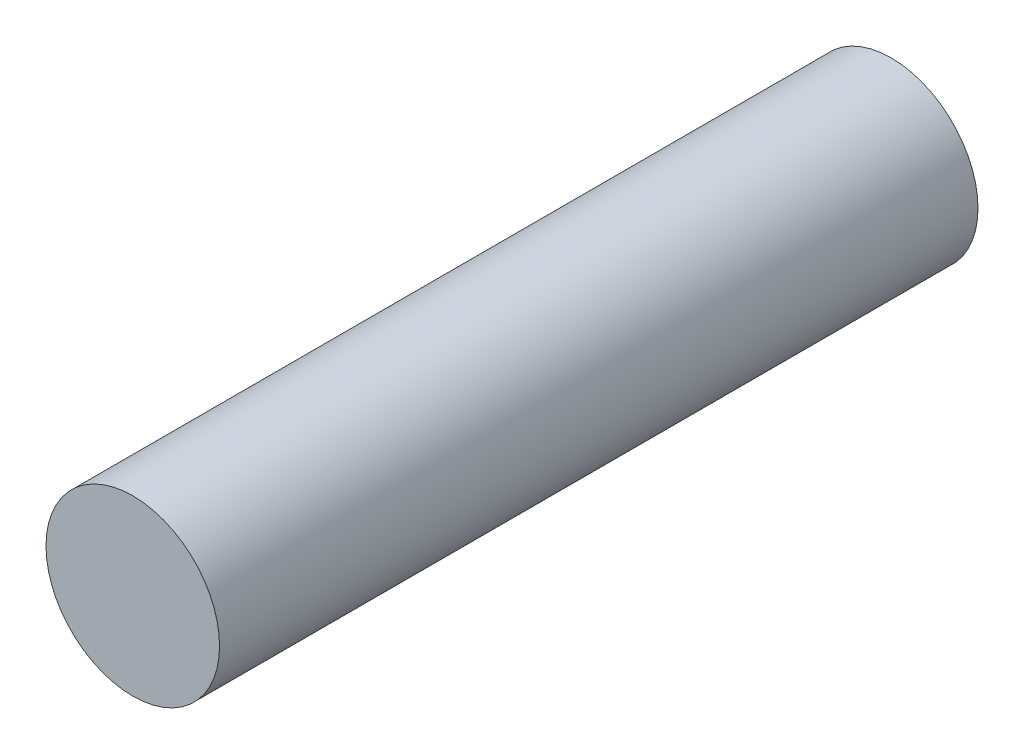
ISO-10303-21;
HEADER;
FILE_DESCRIPTION(('STEP AP214'),'2;1');
FILE_NAME('part.step','',(''),(''),'','','');
FILE_SCHEMA(('AUTOMOTIVE_DESIGN { 1 0 10303 214 1 1 1 1 }'));
ENDSEC;
DATA;
#1=APPLICATION_CONTEXT('core data for automotive mechanical design processes');
#2=APPLICATION_PROTOCOL_DEFINITION('international standard','automotive_design',2000,#1);
#3=PRODUCT_CONTEXT('',#1,'mechanical');
#4=PRODUCT('Part','Part','',(#3));
#5=PRODUCT_RELATED_PRODUCT_CATEGORY('part','',(#4));
#6=PRODUCT_DEFINITION_FORMATION('','',#4);
#7=PRODUCT_DEFINITION_CONTEXT('part definition',#1,'design');
#8=PRODUCT_DEFINITION('design','',#6,#7);
#9=PRODUCT_DEFINITION_SHAPE('','',#8);
#10=(LENGTH_UNIT() NAMED_UNIT(*) SI_UNIT(.MILLI.,.METRE.));
#11=(NAMED_UNIT(*) PLANE_ANGLE_UNIT() SI_UNIT($,.RADIAN.));
#12=(NAMED_UNIT(*) SI_UNIT($,.STERADIAN.) SOLID_ANGLE_UNIT());
#13=UNCERTAINTY_MEASURE_WITH_UNIT(LENGTH_MEASURE(1.E-05),#10,'distance_accuracy_value','');
#14=(GEOMETRIC_REPRESENTATION_CONTEXT(3) GLOBAL_UNCERTAINTY_ASSIGNED_CONTEXT((#13)) GLOBAL_UNIT_ASSIGNED_CONTEXT((#10,
#11,#12)) REPRESENTATION_CONTEXT('',''));
#15=CARTESIAN_POINT('',(0.,0.,0.));
#16=DIRECTION('',(0.,0.,1.));
#17=DIRECTION('',(1.,0.,0.));
#18=AXIS2_PLACEMENT_3D('',#15,#16,#17);
#19=CARTESIAN_POINT('',(0.,0.,431.8));
#20=DIRECTION('',(0.,0.,-1.));
#21=DIRECTION('',(-1.,0.,0.));
#22=AXIS2_PLACEMENT_3D('',#19,#20,#21);
#23=CYLINDRICAL_SURFACE('',#22,49.403);
#24=CARTESIAN_POINT('',(0.,0.,431.8));
#25=DIRECTION('',(0.,0.,1.));
#26=DIRECTION('',(1.,0.,0.));
#27=AXIS2_PLACEMENT_3D('',#24,#25,#26);
#28=CIRCLE('',#27,49.403);
#29=CARTESIAN_POINT('',(49.403,0.,431.8));
#30=VERTEX_POINT('',#29);
#31=EDGE_CURVE('E10',#30,#30,#28,.T.);
#32=ORIENTED_EDGE('',*,*,#31,.F.);
#33=EDGE_LOOP('',(#32));
#34=FACE_BOUND('',#33,.T.);
#35=CARTESIAN_POINT('',(0.,0.,0.));
#36=DIRECTION('',(0.,0.,1.));
#37=DIRECTION('',(1.,0.,0.));
#38=AXIS2_PLACEMENT_3D('',#35,#36,#37);
#39=CIRCLE('',#38,49.403);
#40=CARTESIAN_POINT('',(49.403,0.,0.));
#41=VERTEX_POINT('',#40);
#42=EDGE_CURVE('E34',#41,#41,#39,.T.);
#43=ORIENTED_EDGE('',*,*,#42,.T.);
#44=EDGE_LOOP('',(#43));
#45=FACE_BOUND('',#44,.T.);
#46=ADVANCED_FACE('F31',(#34,#45),#23,.T.);
#47=CARTESIAN_POINT('',(0.,0.,431.8));
#48=DIRECTION('',(0.,0.,1.));
#49=DIRECTION('',(1.,0.,0.));
#50=AXIS2_PLACEMENT_3D('',#47,#48,#49);
#51=PLANE('',#50);
#52=ORIENTED_EDGE('',*,*,#31,.T.);
#53=EDGE_LOOP('',(#52));
#54=FACE_BOUND('',#53,.T.);
#55=ADVANCED_FACE('F46',(#54),#51,.T.);
#56=CARTESIAN_POINT('',(0.,0.,0.));
#57=DIRECTION('',(0.,0.,1.));
#58=DIRECTION('',(1.,0.,0.));
#59=AXIS2_PLACEMENT_3D('',#56,#57,#58);
#60=PLANE('',#59);
#61=ORIENTED_EDGE('',*,*,#42,.F.);
#62=EDGE_LOOP('',(#61));
#63=FACE_BOUND('',#62,.T.);
#64=ADVANCED_FACE('F44',(#63),#60,.F.);
#65=CLOSED_SHELL('',(#46,#55,#64));
#66=MANIFOLD_SOLID_BREP('B2',#65);
#67=ADVANCED_BREP_SHAPE_REPRESENTATION('',(#18,#66),#14);
#68=SHAPE_DEFINITION_REPRESENTATION(#9,#67);
ENDSEC;
END-ISO-10303-21;
